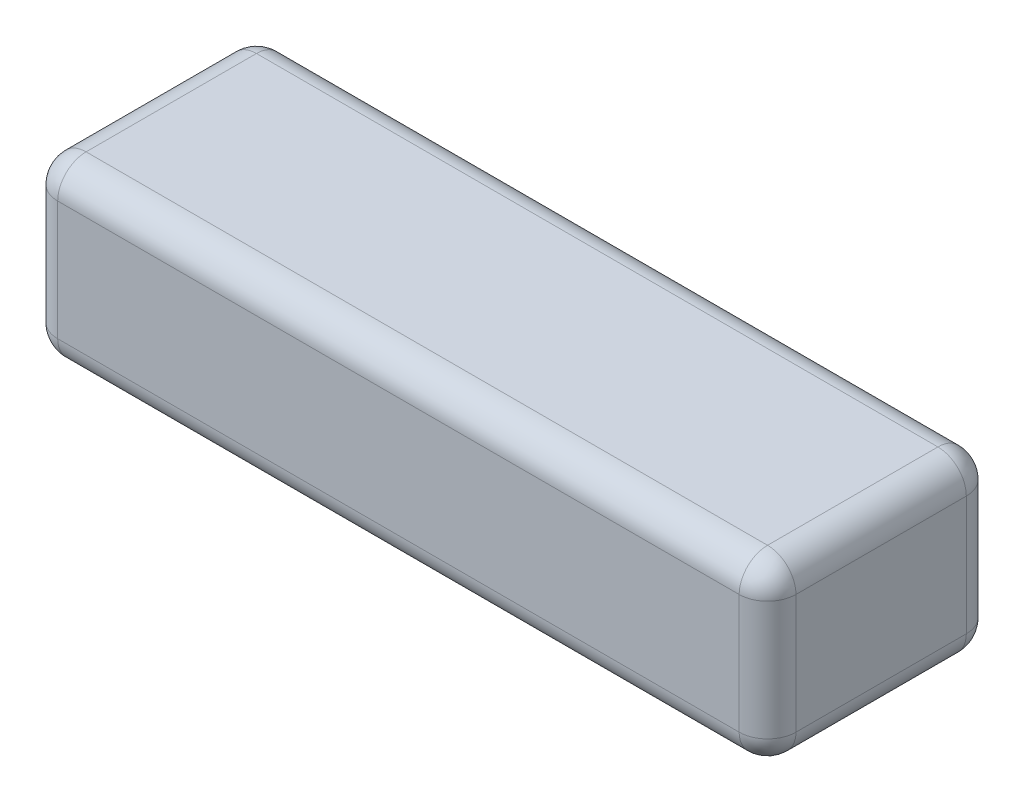
ISO-10303-21;
HEADER;
FILE_DESCRIPTION(('STEP AP214'),'2;1');
FILE_NAME('part.step','',(''),(''),'','','');
FILE_SCHEMA(('AUTOMOTIVE_DESIGN { 1 0 10303 214 1 1 1 1 }'));
ENDSEC;
DATA;
#1=APPLICATION_CONTEXT('core data for automotive mechanical design processes');
#2=APPLICATION_PROTOCOL_DEFINITION('international standard','automotive_design',2000,#1);
#3=PRODUCT_CONTEXT('',#1,'mechanical');
#4=PRODUCT('Part','Part','',(#3));
#5=PRODUCT_RELATED_PRODUCT_CATEGORY('part','',(#4));
#6=PRODUCT_DEFINITION_FORMATION('','',#4);
#7=PRODUCT_DEFINITION_CONTEXT('part definition',#1,'design');
#8=PRODUCT_DEFINITION('design','',#6,#7);
#9=PRODUCT_DEFINITION_SHAPE('','',#8);
#10=(LENGTH_UNIT() NAMED_UNIT(*) SI_UNIT(.MILLI.,.METRE.));
#11=(NAMED_UNIT(*) PLANE_ANGLE_UNIT() SI_UNIT($,.RADIAN.));
#12=(NAMED_UNIT(*) SI_UNIT($,.STERADIAN.) SOLID_ANGLE_UNIT());
#13=UNCERTAINTY_MEASURE_WITH_UNIT(LENGTH_MEASURE(1.E-05),#10,'distance_accuracy_value','');
#14=(GEOMETRIC_REPRESENTATION_CONTEXT(3) GLOBAL_UNCERTAINTY_ASSIGNED_CONTEXT((#13)) GLOBAL_UNIT_ASSIGNED_CONTEXT((#10,
#11,#12)) REPRESENTATION_CONTEXT('',''));
#15=CARTESIAN_POINT('',(0.,0.,0.));
#16=DIRECTION('',(0.,0.,1.));
#17=DIRECTION('',(1.,0.,0.));
#18=AXIS2_PLACEMENT_3D('',#15,#16,#17);
#19=CARTESIAN_POINT('',(0.,31.,-40.));
#20=DIRECTION('',(1.,0.,0.));
#21=DIRECTION('',(0.,0.,-1.));
#22=AXIS2_PLACEMENT_3D('',#19,#20,#21);
#23=PLANE('',#22);
#24=DIRECTION('',(0.,-1.,0.));
#25=VECTOR('',#24,1.);
#26=CARTESIAN_POINT('',(0.,31.,-35.));
#27=LINE('',#26,#25);
#28=CARTESIAN_POINT('',(0.,26.,-35.));
#29=VERTEX_POINT('',#28);
#30=CARTESIAN_POINT('',(0.,5.,-35.));
#31=VERTEX_POINT('',#30);
#32=EDGE_CURVE('E283',#29,#31,#27,.T.);
#33=ORIENTED_EDGE('',*,*,#32,.T.);
#34=DIRECTION('',(0.,0.,1.));
#35=VECTOR('',#34,1.);
#36=CARTESIAN_POINT('',(0.,5.,-40.));
#37=LINE('',#36,#35);
#38=CARTESIAN_POINT('',(0.,5.,-5.));
#39=VERTEX_POINT('',#38);
#40=EDGE_CURVE('E285',#31,#39,#37,.T.);
#41=ORIENTED_EDGE('',*,*,#40,.T.);
#42=DIRECTION('',(0.,-1.,0.));
#43=VECTOR('',#42,1.);
#44=CARTESIAN_POINT('',(0.,31.,-5.));
#45=LINE('',#44,#43);
#46=CARTESIAN_POINT('',(0.,26.,-5.));
#47=VERTEX_POINT('',#46);
#48=EDGE_CURVE('E214',#39,#47,#45,.F.);
#49=ORIENTED_EDGE('',*,*,#48,.T.);
#50=DIRECTION('',(0.,0.,1.));
#51=VECTOR('',#50,1.);
#52=CARTESIAN_POINT('',(0.,26.,-40.));
#53=LINE('',#52,#51);
#54=EDGE_CURVE('E266',#47,#29,#53,.F.);
#55=ORIENTED_EDGE('',*,*,#54,.T.);
#56=EDGE_LOOP('',(#33,#41,#49,#55));
#57=FACE_BOUND('',#56,.T.);
#58=ADVANCED_FACE('F34',(#57),#23,.F.);
#59=CARTESIAN_POINT('',(0.,31.,0.));
#60=DIRECTION('',(0.,0.,-1.));
#61=DIRECTION('',(-1.,0.,0.));
#62=AXIS2_PLACEMENT_3D('',#59,#60,#61);
#63=PLANE('',#62);
#64=DIRECTION('',(0.,-1.,0.));
#65=VECTOR('',#64,1.);
#66=CARTESIAN_POINT('',(5.,31.,0.));
#67=LINE('',#66,#65);
#68=CARTESIAN_POINT('',(5.,26.,0.));
#69=VERTEX_POINT('',#68);
#70=CARTESIAN_POINT('',(5.,5.,0.));
#71=VERTEX_POINT('',#70);
#72=EDGE_CURVE('E216',#69,#71,#67,.T.);
#73=ORIENTED_EDGE('',*,*,#72,.T.);
#74=DIRECTION('',(1.,0.,0.));
#75=VECTOR('',#74,1.);
#76=CARTESIAN_POINT('',(0.,5.,0.));
#77=LINE('',#76,#75);
#78=CARTESIAN_POINT('',(125.,5.,0.));
#79=VERTEX_POINT('',#78);
#80=EDGE_CURVE('E220',#71,#79,#77,.T.);
#81=ORIENTED_EDGE('',*,*,#80,.T.);
#82=DIRECTION('',(0.,-1.,0.));
#83=VECTOR('',#82,1.);
#84=CARTESIAN_POINT('',(125.,31.,0.));
#85=LINE('',#84,#83);
#86=CARTESIAN_POINT('',(125.,26.,0.));
#87=VERTEX_POINT('',#86);
#88=EDGE_CURVE('E221',#79,#87,#85,.F.);
#89=ORIENTED_EDGE('',*,*,#88,.T.);
#90=DIRECTION('',(1.,0.,0.));
#91=VECTOR('',#90,1.);
#92=CARTESIAN_POINT('',(0.,26.,0.));
#93=LINE('',#92,#91);
#94=EDGE_CURVE('E225',#87,#69,#93,.F.);
#95=ORIENTED_EDGE('',*,*,#94,.T.);
#96=EDGE_LOOP('',(#73,#81,#89,#95));
#97=FACE_BOUND('',#96,.T.);
#98=ADVANCED_FACE('F287',(#97),#63,.F.);
#99=CARTESIAN_POINT('',(130.,31.,-40.));
#100=DIRECTION('',(-1.,0.,0.));
#101=DIRECTION('',(0.,0.,1.));
#102=AXIS2_PLACEMENT_3D('',#99,#100,#101);
#103=PLANE('',#102);
#104=DIRECTION('',(0.,-1.,0.));
#105=VECTOR('',#104,1.);
#106=CARTESIAN_POINT('',(130.,31.,-5.));
#107=LINE('',#106,#105);
#108=CARTESIAN_POINT('',(130.,26.,-5.));
#109=VERTEX_POINT('',#108);
#110=CARTESIAN_POINT('',(130.,5.,-5.));
#111=VERTEX_POINT('',#110);
#112=EDGE_CURVE('E135',#109,#111,#107,.T.);
#113=ORIENTED_EDGE('',*,*,#112,.T.);
#114=DIRECTION('',(0.,0.,-1.));
#115=VECTOR('',#114,1.);
#116=CARTESIAN_POINT('',(130.,5.,-40.));
#117=LINE('',#116,#115);
#118=CARTESIAN_POINT('',(130.,5.,-35.));
#119=VERTEX_POINT('',#118);
#120=EDGE_CURVE('E131',#111,#119,#117,.T.);
#121=ORIENTED_EDGE('',*,*,#120,.T.);
#122=DIRECTION('',(0.,-1.,0.));
#123=VECTOR('',#122,1.);
#124=CARTESIAN_POINT('',(130.,31.,-35.));
#125=LINE('',#124,#123);
#126=CARTESIAN_POINT('',(130.,26.,-35.));
#127=VERTEX_POINT('',#126);
#128=EDGE_CURVE('E125',#119,#127,#125,.F.);
#129=ORIENTED_EDGE('',*,*,#128,.T.);
#130=DIRECTION('',(0.,0.,-1.));
#131=VECTOR('',#130,1.);
#132=CARTESIAN_POINT('',(130.,26.,0.));
#133=LINE('',#132,#131);
#134=EDGE_CURVE('E128',#127,#109,#133,.F.);
#135=ORIENTED_EDGE('',*,*,#134,.T.);
#136=EDGE_LOOP('',(#113,#121,#129,#135));
#137=FACE_BOUND('',#136,.T.);
#138=ADVANCED_FACE('F127',(#137),#103,.F.);
#139=CARTESIAN_POINT('',(0.,31.,-40.));
#140=DIRECTION('',(0.,0.,1.));
#141=DIRECTION('',(1.,0.,0.));
#142=AXIS2_PLACEMENT_3D('',#139,#140,#141);
#143=PLANE('',#142);
#144=DIRECTION('',(0.,-1.,0.));
#145=VECTOR('',#144,1.);
#146=CARTESIAN_POINT('',(125.,31.,-40.));
#147=LINE('',#146,#145);
#148=CARTESIAN_POINT('',(125.,26.,-40.));
#149=VERTEX_POINT('',#148);
#150=CARTESIAN_POINT('',(125.,5.,-40.));
#151=VERTEX_POINT('',#150);
#152=EDGE_CURVE('E157',#149,#151,#147,.T.);
#153=ORIENTED_EDGE('',*,*,#152,.T.);
#154=DIRECTION('',(-1.,0.,0.));
#155=VECTOR('',#154,1.);
#156=CARTESIAN_POINT('',(0.,5.,-40.));
#157=LINE('',#156,#155);
#158=CARTESIAN_POINT('',(5.,5.,-40.));
#159=VERTEX_POINT('',#158);
#160=EDGE_CURVE('E233',#151,#159,#157,.T.);
#161=ORIENTED_EDGE('',*,*,#160,.T.);
#162=DIRECTION('',(0.,-1.,0.));
#163=VECTOR('',#162,1.);
#164=CARTESIAN_POINT('',(5.,31.,-40.));
#165=LINE('',#164,#163);
#166=CARTESIAN_POINT('',(5.,26.,-40.));
#167=VERTEX_POINT('',#166);
#168=EDGE_CURVE('E231',#159,#167,#165,.F.);
#169=ORIENTED_EDGE('',*,*,#168,.T.);
#170=DIRECTION('',(-1.,0.,0.));
#171=VECTOR('',#170,1.);
#172=CARTESIAN_POINT('',(130.,26.,-40.));
#173=LINE('',#172,#171);
#174=EDGE_CURVE('E223',#167,#149,#173,.F.);
#175=ORIENTED_EDGE('',*,*,#174,.T.);
#176=EDGE_LOOP('',(#153,#161,#169,#175));
#177=FACE_BOUND('',#176,.T.);
#178=ADVANCED_FACE('F368',(#177),#143,.F.);
#179=CARTESIAN_POINT('',(0.,31.,0.));
#180=DIRECTION('',(0.,1.,0.));
#181=DIRECTION('',(0.,0.,1.));
#182=AXIS2_PLACEMENT_3D('',#179,#180,#181);
#183=PLANE('',#182);
#184=DIRECTION('',(-1.,0.,0.));
#185=VECTOR('',#184,1.);
#186=CARTESIAN_POINT('',(0.,31.,-35.));
#187=LINE('',#186,#185);
#188=CARTESIAN_POINT('',(125.,31.,-35.));
#189=VERTEX_POINT('',#188);
#190=CARTESIAN_POINT('',(5.,31.,-35.));
#191=VERTEX_POINT('',#190);
#192=EDGE_CURVE('E43',#189,#191,#187,.T.);
#193=ORIENTED_EDGE('',*,*,#192,.T.);
#194=DIRECTION('',(0.,0.,1.));
#195=VECTOR('',#194,1.);
#196=CARTESIAN_POINT('',(5.,31.,0.));
#197=LINE('',#196,#195);
#198=CARTESIAN_POINT('',(5.,31.,-5.));
#199=VERTEX_POINT('',#198);
#200=EDGE_CURVE('E11',#191,#199,#197,.T.);
#201=ORIENTED_EDGE('',*,*,#200,.T.);
#202=DIRECTION('',(1.,0.,0.));
#203=VECTOR('',#202,1.);
#204=CARTESIAN_POINT('',(130.,31.,-5.));
#205=LINE('',#204,#203);
#206=CARTESIAN_POINT('',(125.,31.,-5.));
#207=VERTEX_POINT('',#206);
#208=EDGE_CURVE('E57',#199,#207,#205,.T.);
#209=ORIENTED_EDGE('',*,*,#208,.T.);
#210=DIRECTION('',(0.,0.,-1.));
#211=VECTOR('',#210,1.);
#212=CARTESIAN_POINT('',(125.,31.,-40.));
#213=LINE('',#212,#211);
#214=EDGE_CURVE('E236',#207,#189,#213,.T.);
#215=ORIENTED_EDGE('',*,*,#214,.T.);
#216=EDGE_LOOP('',(#193,#201,#209,#215));
#217=FACE_BOUND('',#216,.T.);
#218=ADVANCED_FACE('F370',(#217),#183,.T.);
#219=CARTESIAN_POINT('',(0.,0.,0.));
#220=DIRECTION('',(0.,1.,0.));
#221=DIRECTION('',(0.,0.,1.));
#222=AXIS2_PLACEMENT_3D('',#219,#220,#221);
#223=PLANE('',#222);
#224=DIRECTION('',(0.,0.,-1.));
#225=VECTOR('',#224,1.);
#226=CARTESIAN_POINT('',(125.,0.,0.));
#227=LINE('',#226,#225);
#228=CARTESIAN_POINT('',(125.,0.,-35.));
#229=VERTEX_POINT('',#228);
#230=CARTESIAN_POINT('',(125.,0.,-5.));
#231=VERTEX_POINT('',#230);
#232=EDGE_CURVE('E267',#229,#231,#227,.F.);
#233=ORIENTED_EDGE('',*,*,#232,.T.);
#234=DIRECTION('',(1.,0.,0.));
#235=VECTOR('',#234,1.);
#236=CARTESIAN_POINT('',(0.,0.,-5.));
#237=LINE('',#236,#235);
#238=CARTESIAN_POINT('',(5.,0.,-5.));
#239=VERTEX_POINT('',#238);
#240=EDGE_CURVE('E261',#231,#239,#237,.F.);
#241=ORIENTED_EDGE('',*,*,#240,.T.);
#242=DIRECTION('',(0.,0.,1.));
#243=VECTOR('',#242,1.);
#244=CARTESIAN_POINT('',(5.,0.,0.));
#245=LINE('',#244,#243);
#246=CARTESIAN_POINT('',(5.,0.,-35.));
#247=VERTEX_POINT('',#246);
#248=EDGE_CURVE('E276',#239,#247,#245,.F.);
#249=ORIENTED_EDGE('',*,*,#248,.T.);
#250=DIRECTION('',(-1.,0.,0.));
#251=VECTOR('',#250,1.);
#252=CARTESIAN_POINT('',(0.,0.,-35.));
#253=LINE('',#252,#251);
#254=EDGE_CURVE('E272',#247,#229,#253,.F.);
#255=ORIENTED_EDGE('',*,*,#254,.T.);
#256=EDGE_LOOP('',(#233,#241,#249,#255));
#257=FACE_BOUND('',#256,.T.);
#258=ADVANCED_FACE('F270',(#257),#223,.F.);
#259=CARTESIAN_POINT('',(5.,26.,0.));
#260=DIRECTION('',(0.,0.,-1.));
#261=DIRECTION('',(-1.,0.,0.));
#262=AXIS2_PLACEMENT_3D('',#259,#260,#261);
#263=CYLINDRICAL_SURFACE('',#262,5.);
#264=CARTESIAN_POINT('',(5.,26.,-5.));
#265=DIRECTION('',(0.,0.,1.));
#266=DIRECTION('',(1.,0.,0.));
#267=AXIS2_PLACEMENT_3D('',#264,#265,#266);
#268=CIRCLE('',#267,5.);
#269=EDGE_CURVE('E38',#199,#47,#268,.T.);
#270=ORIENTED_EDGE('',*,*,#269,.F.);
#271=ORIENTED_EDGE('',*,*,#200,.F.);
#272=CARTESIAN_POINT('',(5.,26.,-35.));
#273=DIRECTION('',(0.,0.,-1.));
#274=DIRECTION('',(-1.,0.,0.));
#275=AXIS2_PLACEMENT_3D('',#272,#273,#274);
#276=CIRCLE('',#275,5.);
#277=EDGE_CURVE('E196',#29,#191,#276,.T.);
#278=ORIENTED_EDGE('',*,*,#277,.F.);
#279=ORIENTED_EDGE('',*,*,#54,.F.);
#280=EDGE_LOOP('',(#270,#271,#278,#279));
#281=FACE_BOUND('',#280,.T.);
#282=ADVANCED_FACE('F36',(#281),#263,.T.);
#283=CARTESIAN_POINT('',(5.,26.,-5.));
#284=DIRECTION('',(0.,0.,1.));
#285=DIRECTION('',(1.,0.,0.));
#286=AXIS2_PLACEMENT_3D('',#283,#284,#285);
#287=SPHERICAL_SURFACE('',#286,5.);
#288=CARTESIAN_POINT('',(5.,26.,-5.));
#289=DIRECTION('',(-1.,0.,0.));
#290=DIRECTION('',(0.,0.,1.));
#291=AXIS2_PLACEMENT_3D('',#288,#289,#290);
#292=CIRCLE('',#291,5.);
#293=EDGE_CURVE('E192',#199,#69,#292,.F.);
#294=ORIENTED_EDGE('',*,*,#293,.F.);
#295=ORIENTED_EDGE('',*,*,#269,.T.);
#296=CARTESIAN_POINT('',(5.,26.,-5.));
#297=DIRECTION('',(0.,1.,0.));
#298=DIRECTION('',(0.,0.,1.));
#299=AXIS2_PLACEMENT_3D('',#296,#297,#298);
#300=CIRCLE('',#299,5.);
#301=EDGE_CURVE('E194',#69,#47,#300,.F.);
#302=ORIENTED_EDGE('',*,*,#301,.F.);
#303=EDGE_LOOP('',(#294,#295,#302));
#304=FACE_BOUND('',#303,.T.);
#305=ADVANCED_FACE('F206',(#304),#287,.T.);
#306=CARTESIAN_POINT('',(5.,26.,-35.));
#307=DIRECTION('',(0.,0.,1.));
#308=DIRECTION('',(1.,0.,0.));
#309=AXIS2_PLACEMENT_3D('',#306,#307,#308);
#310=SPHERICAL_SURFACE('',#309,5.);
#311=CARTESIAN_POINT('',(5.,26.,-35.));
#312=DIRECTION('',(0.,1.,0.));
#313=DIRECTION('',(0.,0.,1.));
#314=AXIS2_PLACEMENT_3D('',#311,#312,#313);
#315=CIRCLE('',#314,5.);
#316=EDGE_CURVE('E186',#29,#167,#315,.F.);
#317=ORIENTED_EDGE('',*,*,#316,.F.);
#318=ORIENTED_EDGE('',*,*,#277,.T.);
#319=CARTESIAN_POINT('',(5.,26.,-35.));
#320=DIRECTION('',(-1.,0.,0.));
#321=DIRECTION('',(0.,0.,1.));
#322=AXIS2_PLACEMENT_3D('',#319,#320,#321);
#323=CIRCLE('',#322,5.);
#324=EDGE_CURVE('E189',#167,#191,#323,.F.);
#325=ORIENTED_EDGE('',*,*,#324,.F.);
#326=EDGE_LOOP('',(#317,#318,#325));
#327=FACE_BOUND('',#326,.T.);
#328=ADVANCED_FACE('F297',(#327),#310,.T.);
#329=CARTESIAN_POINT('',(5.,31.,-5.));
#330=DIRECTION('',(0.,-1.,0.));
#331=DIRECTION('',(0.,0.,-1.));
#332=AXIS2_PLACEMENT_3D('',#329,#330,#331);
#333=CYLINDRICAL_SURFACE('',#332,5.);
#334=ORIENTED_EDGE('',*,*,#301,.T.);
#335=ORIENTED_EDGE('',*,*,#48,.F.);
#336=CARTESIAN_POINT('',(5.,5.,-5.));
#337=DIRECTION('',(0.,-1.,0.));
#338=DIRECTION('',(0.,0.,-1.));
#339=AXIS2_PLACEMENT_3D('',#336,#337,#338);
#340=CIRCLE('',#339,5.);
#341=EDGE_CURVE('E181',#71,#39,#340,.T.);
#342=ORIENTED_EDGE('',*,*,#341,.F.);
#343=ORIENTED_EDGE('',*,*,#72,.F.);
#344=EDGE_LOOP('',(#334,#335,#342,#343));
#345=FACE_BOUND('',#344,.T.);
#346=ADVANCED_FACE('F212',(#345),#333,.T.);
#347=CARTESIAN_POINT('',(0.,26.,-5.));
#348=DIRECTION('',(-1.,0.,0.));
#349=DIRECTION('',(0.,0.,1.));
#350=AXIS2_PLACEMENT_3D('',#347,#348,#349);
#351=CYLINDRICAL_SURFACE('',#350,5.);
#352=ORIENTED_EDGE('',*,*,#293,.T.);
#353=ORIENTED_EDGE('',*,*,#94,.F.);
#354=CARTESIAN_POINT('',(125.,26.,-5.));
#355=DIRECTION('',(1.,0.,0.));
#356=DIRECTION('',(0.,0.,-1.));
#357=AXIS2_PLACEMENT_3D('',#354,#355,#356);
#358=CIRCLE('',#357,5.);
#359=EDGE_CURVE('E178',#207,#87,#358,.T.);
#360=ORIENTED_EDGE('',*,*,#359,.F.);
#361=ORIENTED_EDGE('',*,*,#208,.F.);
#362=EDGE_LOOP('',(#352,#353,#360,#361));
#363=FACE_BOUND('',#362,.T.);
#364=ADVANCED_FACE('F288',(#363),#351,.T.);
#365=CARTESIAN_POINT('',(125.,26.,0.));
#366=DIRECTION('',(0.,0.,1.));
#367=DIRECTION('',(1.,0.,0.));
#368=AXIS2_PLACEMENT_3D('',#365,#366,#367);
#369=CYLINDRICAL_SURFACE('',#368,5.);
#370=CARTESIAN_POINT('',(125.,26.,-35.));
#371=DIRECTION('',(0.,0.,-1.));
#372=DIRECTION('',(-1.,0.,0.));
#373=AXIS2_PLACEMENT_3D('',#370,#371,#372);
#374=CIRCLE('',#373,5.);
#375=EDGE_CURVE('E142',#189,#127,#374,.T.);
#376=ORIENTED_EDGE('',*,*,#375,.F.);
#377=ORIENTED_EDGE('',*,*,#214,.F.);
#378=CARTESIAN_POINT('',(125.,26.,-5.));
#379=DIRECTION('',(0.,0.,1.));
#380=DIRECTION('',(0.,-1.,0.));
#381=AXIS2_PLACEMENT_3D('',#378,#379,#380);
#382=CIRCLE('',#381,5.);
#383=EDGE_CURVE('E145',#109,#207,#382,.T.);
#384=ORIENTED_EDGE('',*,*,#383,.F.);
#385=ORIENTED_EDGE('',*,*,#134,.F.);
#386=EDGE_LOOP('',(#376,#377,#384,#385));
#387=FACE_BOUND('',#386,.T.);
#388=ADVANCED_FACE('F140',(#387),#369,.T.);
#389=CARTESIAN_POINT('',(0.,26.,-35.));
#390=DIRECTION('',(1.,0.,0.));
#391=DIRECTION('',(0.,0.,-1.));
#392=AXIS2_PLACEMENT_3D('',#389,#390,#391);
#393=CYLINDRICAL_SURFACE('',#392,5.);
#394=ORIENTED_EDGE('',*,*,#324,.T.);
#395=ORIENTED_EDGE('',*,*,#192,.F.);
#396=CARTESIAN_POINT('',(125.,26.,-35.));
#397=DIRECTION('',(1.,0.,0.));
#398=DIRECTION('',(0.,0.,-1.));
#399=AXIS2_PLACEMENT_3D('',#396,#397,#398);
#400=CIRCLE('',#399,5.);
#401=EDGE_CURVE('E154',#149,#189,#400,.T.);
#402=ORIENTED_EDGE('',*,*,#401,.F.);
#403=ORIENTED_EDGE('',*,*,#174,.F.);
#404=EDGE_LOOP('',(#394,#395,#402,#403));
#405=FACE_BOUND('',#404,.T.);
#406=ADVANCED_FACE('F295',(#405),#393,.T.);
#407=CARTESIAN_POINT('',(5.,31.,-35.));
#408=DIRECTION('',(0.,-1.,0.));
#409=DIRECTION('',(0.,0.,-1.));
#410=AXIS2_PLACEMENT_3D('',#407,#408,#409);
#411=CYLINDRICAL_SURFACE('',#410,5.);
#412=ORIENTED_EDGE('',*,*,#316,.T.);
#413=ORIENTED_EDGE('',*,*,#168,.F.);
#414=CARTESIAN_POINT('',(5.,5.,-35.));
#415=DIRECTION('',(0.,-1.,0.));
#416=DIRECTION('',(0.,0.,-1.));
#417=AXIS2_PLACEMENT_3D('',#414,#415,#416);
#418=CIRCLE('',#417,5.);
#419=EDGE_CURVE('E173',#31,#159,#418,.T.);
#420=ORIENTED_EDGE('',*,*,#419,.F.);
#421=ORIENTED_EDGE('',*,*,#32,.F.);
#422=EDGE_LOOP('',(#412,#413,#420,#421));
#423=FACE_BOUND('',#422,.T.);
#424=ADVANCED_FACE('F346',(#423),#411,.T.);
#425=CARTESIAN_POINT('',(5.,5.,-40.));
#426=DIRECTION('',(0.,0.,1.));
#427=DIRECTION('',(1.,0.,0.));
#428=AXIS2_PLACEMENT_3D('',#425,#426,#427);
#429=CYLINDRICAL_SURFACE('',#428,5.);
#430=CARTESIAN_POINT('',(5.,5.,-5.));
#431=DIRECTION('',(0.,0.,1.));
#432=DIRECTION('',(1.,0.,0.));
#433=AXIS2_PLACEMENT_3D('',#430,#431,#432);
#434=CIRCLE('',#433,5.);
#435=EDGE_CURVE('E183',#39,#239,#434,.T.);
#436=ORIENTED_EDGE('',*,*,#435,.F.);
#437=ORIENTED_EDGE('',*,*,#40,.F.);
#438=CARTESIAN_POINT('',(5.,5.,-35.));
#439=DIRECTION('',(0.,0.,-1.));
#440=DIRECTION('',(-1.,0.,0.));
#441=AXIS2_PLACEMENT_3D('',#438,#439,#440);
#442=CIRCLE('',#441,5.);
#443=EDGE_CURVE('E170',#247,#31,#442,.T.);
#444=ORIENTED_EDGE('',*,*,#443,.F.);
#445=ORIENTED_EDGE('',*,*,#248,.F.);
#446=EDGE_LOOP('',(#436,#437,#444,#445));
#447=FACE_BOUND('',#446,.T.);
#448=ADVANCED_FACE('F342',(#447),#429,.T.);
#449=CARTESIAN_POINT('',(5.,5.,-5.));
#450=DIRECTION('',(0.,0.,1.));
#451=DIRECTION('',(1.,0.,0.));
#452=AXIS2_PLACEMENT_3D('',#449,#450,#451);
#453=SPHERICAL_SURFACE('',#452,5.);
#454=ORIENTED_EDGE('',*,*,#341,.T.);
#455=ORIENTED_EDGE('',*,*,#435,.T.);
#456=CARTESIAN_POINT('',(5.,5.,-5.));
#457=DIRECTION('',(-1.,0.,0.));
#458=DIRECTION('',(0.,0.,1.));
#459=AXIS2_PLACEMENT_3D('',#456,#457,#458);
#460=CIRCLE('',#459,5.);
#461=EDGE_CURVE('E162',#71,#239,#460,.F.);
#462=ORIENTED_EDGE('',*,*,#461,.F.);
#463=EDGE_LOOP('',(#454,#455,#462));
#464=FACE_BOUND('',#463,.T.);
#465=ADVANCED_FACE('F338',(#464),#453,.T.);
#466=CARTESIAN_POINT('',(125.,26.,-5.));
#467=DIRECTION('',(0.,0.,1.));
#468=DIRECTION('',(1.,0.,0.));
#469=AXIS2_PLACEMENT_3D('',#466,#467,#468);
#470=SPHERICAL_SURFACE('',#469,5.);
#471=ORIENTED_EDGE('',*,*,#383,.T.);
#472=ORIENTED_EDGE('',*,*,#359,.T.);
#473=CARTESIAN_POINT('',(125.,26.,-5.));
#474=DIRECTION('',(0.,1.,0.));
#475=DIRECTION('',(0.,0.,1.));
#476=AXIS2_PLACEMENT_3D('',#473,#474,#475);
#477=CIRCLE('',#476,5.);
#478=EDGE_CURVE('E158',#109,#87,#477,.F.);
#479=ORIENTED_EDGE('',*,*,#478,.F.);
#480=EDGE_LOOP('',(#471,#472,#479));
#481=FACE_BOUND('',#480,.T.);
#482=ADVANCED_FACE('F335',(#481),#470,.T.);
#483=CARTESIAN_POINT('',(125.,26.,-35.));
#484=DIRECTION('',(0.,0.,1.));
#485=DIRECTION('',(1.,0.,0.));
#486=AXIS2_PLACEMENT_3D('',#483,#484,#485);
#487=SPHERICAL_SURFACE('',#486,5.);
#488=ORIENTED_EDGE('',*,*,#401,.T.);
#489=ORIENTED_EDGE('',*,*,#375,.T.);
#490=CARTESIAN_POINT('',(125.,26.,-35.));
#491=DIRECTION('',(0.,1.,0.));
#492=DIRECTION('',(0.,0.,1.));
#493=AXIS2_PLACEMENT_3D('',#490,#491,#492);
#494=CIRCLE('',#493,5.);
#495=EDGE_CURVE('E151',#149,#127,#494,.F.);
#496=ORIENTED_EDGE('',*,*,#495,.F.);
#497=EDGE_LOOP('',(#488,#489,#496));
#498=FACE_BOUND('',#497,.T.);
#499=ADVANCED_FACE('F150',(#498),#487,.T.);
#500=CARTESIAN_POINT('',(5.,5.,-35.));
#501=DIRECTION('',(0.,0.,1.));
#502=DIRECTION('',(1.,0.,0.));
#503=AXIS2_PLACEMENT_3D('',#500,#501,#502);
#504=SPHERICAL_SURFACE('',#503,5.);
#505=ORIENTED_EDGE('',*,*,#443,.T.);
#506=ORIENTED_EDGE('',*,*,#419,.T.);
#507=CARTESIAN_POINT('',(5.,5.,-35.));
#508=DIRECTION('',(-1.,0.,0.));
#509=DIRECTION('',(0.,0.,1.));
#510=AXIS2_PLACEMENT_3D('',#507,#508,#509);
#511=CIRCLE('',#510,5.);
#512=EDGE_CURVE('E159',#247,#159,#511,.F.);
#513=ORIENTED_EDGE('',*,*,#512,.F.);
#514=EDGE_LOOP('',(#505,#506,#513));
#515=FACE_BOUND('',#514,.T.);
#516=ADVANCED_FACE('F329',(#515),#504,.T.);
#517=CARTESIAN_POINT('',(0.,5.,-5.));
#518=DIRECTION('',(1.,0.,0.));
#519=DIRECTION('',(0.,0.,-1.));
#520=AXIS2_PLACEMENT_3D('',#517,#518,#519);
#521=CYLINDRICAL_SURFACE('',#520,5.);
#522=ORIENTED_EDGE('',*,*,#461,.T.);
#523=ORIENTED_EDGE('',*,*,#240,.F.);
#524=CARTESIAN_POINT('',(125.,5.,-5.));
#525=DIRECTION('',(1.,0.,0.));
#526=DIRECTION('',(0.,0.,-1.));
#527=AXIS2_PLACEMENT_3D('',#524,#525,#526);
#528=CIRCLE('',#527,5.);
#529=EDGE_CURVE('E164',#79,#231,#528,.T.);
#530=ORIENTED_EDGE('',*,*,#529,.F.);
#531=ORIENTED_EDGE('',*,*,#80,.F.);
#532=EDGE_LOOP('',(#522,#523,#530,#531));
#533=FACE_BOUND('',#532,.T.);
#534=ADVANCED_FACE('F263',(#533),#521,.T.);
#535=CARTESIAN_POINT('',(125.,31.,-5.));
#536=DIRECTION('',(0.,-1.,0.));
#537=DIRECTION('',(0.,0.,-1.));
#538=AXIS2_PLACEMENT_3D('',#535,#536,#537);
#539=CYLINDRICAL_SURFACE('',#538,5.);
#540=ORIENTED_EDGE('',*,*,#478,.T.);
#541=ORIENTED_EDGE('',*,*,#88,.F.);
#542=CARTESIAN_POINT('',(125.,5.,-5.));
#543=DIRECTION('',(0.,-1.,0.));
#544=DIRECTION('',(0.,0.,-1.));
#545=AXIS2_PLACEMENT_3D('',#542,#543,#544);
#546=CIRCLE('',#545,5.);
#547=EDGE_CURVE('E250',#111,#79,#546,.T.);
#548=ORIENTED_EDGE('',*,*,#547,.F.);
#549=ORIENTED_EDGE('',*,*,#112,.F.);
#550=EDGE_LOOP('',(#540,#541,#548,#549));
#551=FACE_BOUND('',#550,.T.);
#552=ADVANCED_FACE('F323',(#551),#539,.T.);
#553=CARTESIAN_POINT('',(125.,31.,-35.));
#554=DIRECTION('',(0.,-1.,0.));
#555=DIRECTION('',(0.,0.,-1.));
#556=AXIS2_PLACEMENT_3D('',#553,#554,#555);
#557=CYLINDRICAL_SURFACE('',#556,5.);
#558=ORIENTED_EDGE('',*,*,#495,.T.);
#559=ORIENTED_EDGE('',*,*,#128,.F.);
#560=CARTESIAN_POINT('',(125.,5.,-35.));
#561=DIRECTION('',(0.,-1.,0.));
#562=DIRECTION('',(0.,0.,-1.));
#563=AXIS2_PLACEMENT_3D('',#560,#561,#562);
#564=CIRCLE('',#563,5.);
#565=EDGE_CURVE('E247',#151,#119,#564,.T.);
#566=ORIENTED_EDGE('',*,*,#565,.F.);
#567=ORIENTED_EDGE('',*,*,#152,.F.);
#568=EDGE_LOOP('',(#558,#559,#566,#567));
#569=FACE_BOUND('',#568,.T.);
#570=ADVANCED_FACE('F156',(#569),#557,.T.);
#571=CARTESIAN_POINT('',(0.,5.,-35.));
#572=DIRECTION('',(-1.,0.,0.));
#573=DIRECTION('',(0.,0.,1.));
#574=AXIS2_PLACEMENT_3D('',#571,#572,#573);
#575=CYLINDRICAL_SURFACE('',#574,5.);
#576=ORIENTED_EDGE('',*,*,#512,.T.);
#577=ORIENTED_EDGE('',*,*,#160,.F.);
#578=CARTESIAN_POINT('',(125.,5.,-35.));
#579=DIRECTION('',(1.,0.,0.));
#580=DIRECTION('',(0.,0.,-1.));
#581=AXIS2_PLACEMENT_3D('',#578,#579,#580);
#582=CIRCLE('',#581,5.);
#583=EDGE_CURVE('E244',#229,#151,#582,.T.);
#584=ORIENTED_EDGE('',*,*,#583,.F.);
#585=ORIENTED_EDGE('',*,*,#254,.F.);
#586=EDGE_LOOP('',(#576,#577,#584,#585));
#587=FACE_BOUND('',#586,.T.);
#588=ADVANCED_FACE('F317',(#587),#575,.T.);
#589=CARTESIAN_POINT('',(125.,5.,-5.));
#590=DIRECTION('',(0.,0.,1.));
#591=DIRECTION('',(1.,0.,0.));
#592=AXIS2_PLACEMENT_3D('',#589,#590,#591);
#593=SPHERICAL_SURFACE('',#592,5.);
#594=ORIENTED_EDGE('',*,*,#547,.T.);
#595=ORIENTED_EDGE('',*,*,#529,.T.);
#596=CARTESIAN_POINT('',(125.,5.,-5.));
#597=DIRECTION('',(0.,0.,1.));
#598=DIRECTION('',(1.,0.,0.));
#599=AXIS2_PLACEMENT_3D('',#596,#597,#598);
#600=CIRCLE('',#599,5.);
#601=EDGE_CURVE('E242',#111,#231,#600,.F.);
#602=ORIENTED_EDGE('',*,*,#601,.F.);
#603=EDGE_LOOP('',(#594,#595,#602));
#604=FACE_BOUND('',#603,.T.);
#605=ADVANCED_FACE('F256',(#604),#593,.T.);
#606=CARTESIAN_POINT('',(125.,5.,-35.));
#607=DIRECTION('',(0.,0.,1.));
#608=DIRECTION('',(1.,0.,0.));
#609=AXIS2_PLACEMENT_3D('',#606,#607,#608);
#610=SPHERICAL_SURFACE('',#609,5.);
#611=ORIENTED_EDGE('',*,*,#583,.T.);
#612=ORIENTED_EDGE('',*,*,#565,.T.);
#613=CARTESIAN_POINT('',(125.,5.,-35.));
#614=DIRECTION('',(0.,0.,-1.));
#615=DIRECTION('',(-1.,0.,0.));
#616=AXIS2_PLACEMENT_3D('',#613,#614,#615);
#617=CIRCLE('',#616,5.);
#618=EDGE_CURVE('E240',#229,#119,#617,.F.);
#619=ORIENTED_EDGE('',*,*,#618,.F.);
#620=EDGE_LOOP('',(#611,#612,#619));
#621=FACE_BOUND('',#620,.T.);
#622=ADVANCED_FACE('F311',(#621),#610,.T.);
#623=CARTESIAN_POINT('',(125.,5.,-40.));
#624=DIRECTION('',(0.,0.,-1.));
#625=DIRECTION('',(-1.,0.,0.));
#626=AXIS2_PLACEMENT_3D('',#623,#624,#625);
#627=CYLINDRICAL_SURFACE('',#626,5.);
#628=ORIENTED_EDGE('',*,*,#601,.T.);
#629=ORIENTED_EDGE('',*,*,#232,.F.);
#630=ORIENTED_EDGE('',*,*,#618,.T.);
#631=ORIENTED_EDGE('',*,*,#120,.F.);
#632=EDGE_LOOP('',(#628,#629,#630,#631));
#633=FACE_BOUND('',#632,.T.);
#634=ADVANCED_FACE('F308',(#633),#627,.T.);
#635=CLOSED_SHELL('',(#58,#98,#138,#178,#218,#258,#282,#305,#328,#346,#364,#388,#406,#424,#448,
#465,#482,#499,#516,#534,#552,#570,#588,#605,#622,#634));
#636=MANIFOLD_SOLID_BREP('B2',#635);
#637=ADVANCED_BREP_SHAPE_REPRESENTATION('',(#18,#636),#14);
#638=SHAPE_DEFINITION_REPRESENTATION(#9,#637);
ENDSEC;
END-ISO-10303-21;
